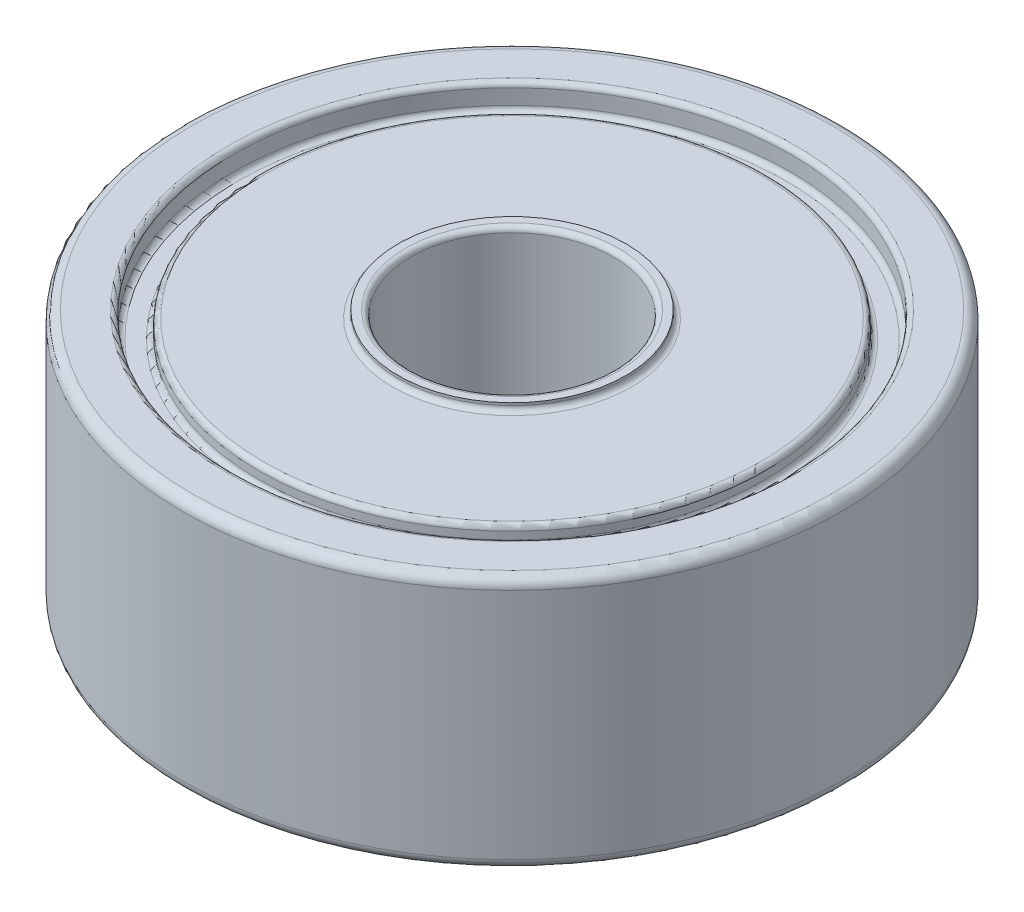
ISO-10303-21;
HEADER;
FILE_DESCRIPTION(('STEP AP214'),'2;1');
FILE_NAME('part.step','',(''),(''),'','','');
FILE_SCHEMA(('AUTOMOTIVE_DESIGN { 1 0 10303 214 1 1 1 1 }'));
ENDSEC;
DATA;
#1=APPLICATION_CONTEXT('core data for automotive mechanical design processes');
#2=APPLICATION_PROTOCOL_DEFINITION('international standard','automotive_design',2000,#1);
#3=PRODUCT_CONTEXT('',#1,'mechanical');
#4=PRODUCT('Part','Part','',(#3));
#5=PRODUCT_RELATED_PRODUCT_CATEGORY('part','',(#4));
#6=PRODUCT_DEFINITION_FORMATION('','',#4);
#7=PRODUCT_DEFINITION_CONTEXT('part definition',#1,'design');
#8=PRODUCT_DEFINITION('design','',#6,#7);
#9=PRODUCT_DEFINITION_SHAPE('','',#8);
#10=(LENGTH_UNIT() NAMED_UNIT(*) SI_UNIT(.MILLI.,.METRE.));
#11=(NAMED_UNIT(*) PLANE_ANGLE_UNIT() SI_UNIT($,.RADIAN.));
#12=(NAMED_UNIT(*) SI_UNIT($,.STERADIAN.) SOLID_ANGLE_UNIT());
#13=UNCERTAINTY_MEASURE_WITH_UNIT(LENGTH_MEASURE(1.E-05),#10,'distance_accuracy_value','');
#14=(GEOMETRIC_REPRESENTATION_CONTEXT(3) GLOBAL_UNCERTAINTY_ASSIGNED_CONTEXT((#13)) GLOBAL_UNIT_ASSIGNED_CONTEXT((#10,
#11,#12)) REPRESENTATION_CONTEXT('',''));
#15=CARTESIAN_POINT('',(0.,0.,0.));
#16=DIRECTION('',(0.,0.,1.));
#17=DIRECTION('',(1.,0.,0.));
#18=AXIS2_PLACEMENT_3D('',#15,#16,#17);
#19=CARTESIAN_POINT('',(0.,-2.5,0.));
#20=DIRECTION('',(0.,1.,0.));
#21=DIRECTION('',(0.,0.,1.));
#22=AXIS2_PLACEMENT_3D('',#19,#20,#21);
#23=PLANE('',#22);
#24=CARTESIAN_POINT('',(0.,-2.5,0.));
#25=DIRECTION('',(0.,1.,0.));
#26=DIRECTION('',(0.,0.,1.));
#27=AXIS2_PLACEMENT_3D('',#24,#25,#26);
#28=CIRCLE('',#27,6.3);
#29=CARTESIAN_POINT('',(0.,-2.5,6.3));
#30=VERTEX_POINT('',#29);
#31=EDGE_CURVE('E105',#30,#30,#28,.F.);
#32=ORIENTED_EDGE('',*,*,#31,.T.);
#33=EDGE_LOOP('',(#32));
#34=FACE_BOUND('',#33,.T.);
#35=CARTESIAN_POINT('',(0.,-2.5,0.));
#36=DIRECTION('',(0.,-1.,0.));
#37=DIRECTION('',(0.,0.,-1.));
#38=AXIS2_PLACEMENT_3D('',#35,#36,#37);
#39=CIRCLE('',#38,5.5);
#40=CARTESIAN_POINT('',(0.,-2.5,-5.5));
#41=VERTEX_POINT('',#40);
#42=EDGE_CURVE('E117',#41,#41,#39,.T.);
#43=ORIENTED_EDGE('',*,*,#42,.F.);
#44=EDGE_LOOP('',(#43));
#45=FACE_BOUND('',#44,.T.);
#46=ADVANCED_FACE('F34',(#34,#45),#23,.F.);
#47=CARTESIAN_POINT('',(0.,-2.5,0.));
#48=DIRECTION('',(0.,1.,0.));
#49=DIRECTION('',(0.,0.,1.));
#50=AXIS2_PLACEMENT_3D('',#47,#48,#49);
#51=CIRCLE('',#50,2.1);
#52=CARTESIAN_POINT('',(0.,-2.5,2.1));
#53=VERTEX_POINT('',#52);
#54=EDGE_CURVE('E49',#53,#53,#51,.T.);
#55=ORIENTED_EDGE('',*,*,#54,.T.);
#56=EDGE_LOOP('',(#55));
#57=FACE_BOUND('',#56,.T.);
#58=CARTESIAN_POINT('',(0.,-2.5,0.));
#59=DIRECTION('',(0.,-1.,0.));
#60=DIRECTION('',(0.,0.,-1.));
#61=AXIS2_PLACEMENT_3D('',#58,#59,#60);
#62=CIRCLE('',#61,2.25);
#63=CARTESIAN_POINT('',(0.,-2.5,-2.25));
#64=VERTEX_POINT('',#63);
#65=EDGE_CURVE('E123',#64,#64,#62,.T.);
#66=ORIENTED_EDGE('',*,*,#65,.T.);
#67=EDGE_LOOP('',(#66));
#68=FACE_BOUND('',#67,.T.);
#69=ADVANCED_FACE('F127',(#57,#68),#23,.F.);
#70=CARTESIAN_POINT('',(0.,2.5,0.));
#71=DIRECTION('',(0.,1.,0.));
#72=DIRECTION('',(0.,0.,1.));
#73=AXIS2_PLACEMENT_3D('',#70,#71,#72);
#74=PLANE('',#73);
#75=CARTESIAN_POINT('',(0.,2.5,0.));
#76=DIRECTION('',(0.,1.,0.));
#77=DIRECTION('',(0.,0.,1.));
#78=AXIS2_PLACEMENT_3D('',#75,#76,#77);
#79=CIRCLE('',#78,5.6);
#80=CARTESIAN_POINT('',(0.,2.5,5.6));
#81=VERTEX_POINT('',#80);
#82=EDGE_CURVE('E78',#81,#81,#79,.F.);
#83=ORIENTED_EDGE('',*,*,#82,.T.);
#84=EDGE_LOOP('',(#83));
#85=FACE_BOUND('',#84,.T.);
#86=CARTESIAN_POINT('',(0.,2.5,0.));
#87=DIRECTION('',(0.,1.,0.));
#88=DIRECTION('',(0.,0.,1.));
#89=AXIS2_PLACEMENT_3D('',#86,#87,#88);
#90=CIRCLE('',#89,6.3);
#91=CARTESIAN_POINT('',(0.,2.5,6.3));
#92=VERTEX_POINT('',#91);
#93=EDGE_CURVE('E102',#92,#92,#90,.T.);
#94=ORIENTED_EDGE('',*,*,#93,.T.);
#95=EDGE_LOOP('',(#94));
#96=FACE_BOUND('',#95,.T.);
#97=ADVANCED_FACE('F152',(#85,#96),#74,.T.);
#98=CARTESIAN_POINT('',(0.,2.5,0.));
#99=DIRECTION('',(0.,1.,0.));
#100=DIRECTION('',(0.,0.,1.));
#101=AXIS2_PLACEMENT_3D('',#98,#99,#100);
#102=CIRCLE('',#101,2.1);
#103=CARTESIAN_POINT('',(0.,2.5,2.1));
#104=VERTEX_POINT('',#103);
#105=EDGE_CURVE('E54',#104,#104,#102,.F.);
#106=ORIENTED_EDGE('',*,*,#105,.T.);
#107=EDGE_LOOP('',(#106));
#108=FACE_BOUND('',#107,.T.);
#109=CARTESIAN_POINT('',(0.,2.5,0.));
#110=DIRECTION('',(0.,-1.,0.));
#111=DIRECTION('',(0.,0.,-1.));
#112=AXIS2_PLACEMENT_3D('',#109,#110,#111);
#113=CIRCLE('',#112,2.25);
#114=CARTESIAN_POINT('',(0.,2.5,-2.25));
#115=VERTEX_POINT('',#114);
#116=EDGE_CURVE('E114',#115,#115,#113,.T.);
#117=ORIENTED_EDGE('',*,*,#116,.F.);
#118=EDGE_LOOP('',(#117));
#119=FACE_BOUND('',#118,.T.);
#120=ADVANCED_FACE('F162',(#108,#119),#74,.T.);
#121=CARTESIAN_POINT('',(0.,2.5,0.));
#122=DIRECTION('',(0.,-1.,0.));
#123=DIRECTION('',(0.,0.,-1.));
#124=AXIS2_PLACEMENT_3D('',#121,#122,#123);
#125=CYLINDRICAL_SURFACE('',#124,6.5);
#126=CARTESIAN_POINT('',(0.,-2.3,0.));
#127=DIRECTION('',(0.,1.,0.));
#128=DIRECTION('',(0.,0.,1.));
#129=AXIS2_PLACEMENT_3D('',#126,#127,#128);
#130=CIRCLE('',#129,6.5);
#131=CARTESIAN_POINT('',(0.,-2.3,6.5));
#132=VERTEX_POINT('',#131);
#133=EDGE_CURVE('E108',#132,#132,#130,.T.);
#134=ORIENTED_EDGE('',*,*,#133,.T.);
#135=EDGE_LOOP('',(#134));
#136=FACE_BOUND('',#135,.T.);
#137=CARTESIAN_POINT('',(0.,2.3,0.));
#138=DIRECTION('',(0.,1.,0.));
#139=DIRECTION('',(0.,0.,1.));
#140=AXIS2_PLACEMENT_3D('',#137,#138,#139);
#141=CIRCLE('',#140,6.5);
#142=CARTESIAN_POINT('',(0.,2.3,6.5));
#143=VERTEX_POINT('',#142);
#144=EDGE_CURVE('E111',#143,#143,#141,.F.);
#145=ORIENTED_EDGE('',*,*,#144,.T.);
#146=EDGE_LOOP('',(#145));
#147=FACE_BOUND('',#146,.T.);
#148=ADVANCED_FACE('F158',(#136,#147),#125,.T.);
#149=CARTESIAN_POINT('',(0.,-2.5,0.));
#150=DIRECTION('',(0.,1.,0.));
#151=DIRECTION('',(0.,0.,1.));
#152=AXIS2_PLACEMENT_3D('',#149,#150,#151);
#153=CYLINDRICAL_SURFACE('',#152,2.);
#154=CARTESIAN_POINT('',(0.,2.4,0.));
#155=DIRECTION('',(0.,1.,0.));
#156=DIRECTION('',(0.,0.,1.));
#157=AXIS2_PLACEMENT_3D('',#154,#155,#156);
#158=CIRCLE('',#157,2.);
#159=CARTESIAN_POINT('',(0.,2.4,2.));
#160=VERTEX_POINT('',#159);
#161=EDGE_CURVE('E57',#160,#160,#158,.T.);
#162=ORIENTED_EDGE('',*,*,#161,.T.);
#163=EDGE_LOOP('',(#162));
#164=FACE_BOUND('',#163,.T.);
#165=CARTESIAN_POINT('',(0.,-2.4,0.));
#166=DIRECTION('',(0.,1.,0.));
#167=DIRECTION('',(0.,0.,1.));
#168=AXIS2_PLACEMENT_3D('',#165,#166,#167);
#169=CIRCLE('',#168,2.);
#170=CARTESIAN_POINT('',(0.,-2.4,2.));
#171=VERTEX_POINT('',#170);
#172=EDGE_CURVE('E60',#171,#171,#169,.F.);
#173=ORIENTED_EDGE('',*,*,#172,.T.);
#174=EDGE_LOOP('',(#173));
#175=FACE_BOUND('',#174,.T.);
#176=ADVANCED_FACE('F161',(#164,#175),#153,.F.);
#177=CARTESIAN_POINT('',(0.,-2.3,0.));
#178=DIRECTION('',(0.,1.,0.));
#179=DIRECTION('',(0.,0.,1.));
#180=AXIS2_PLACEMENT_3D('',#177,#178,#179);
#181=TOROIDAL_SURFACE('',#180,6.3,0.2);
#182=ORIENTED_EDGE('',*,*,#31,.F.);
#183=EDGE_LOOP('',(#182));
#184=FACE_BOUND('',#183,.T.);
#185=ORIENTED_EDGE('',*,*,#133,.F.);
#186=EDGE_LOOP('',(#185));
#187=FACE_BOUND('',#186,.T.);
#188=ADVANCED_FACE('F164',(#184,#187),#181,.T.);
#189=CARTESIAN_POINT('',(0.,2.3,0.));
#190=DIRECTION('',(0.,1.,0.));
#191=DIRECTION('',(0.,0.,1.));
#192=AXIS2_PLACEMENT_3D('',#189,#190,#191);
#193=TOROIDAL_SURFACE('',#192,6.3,0.2);
#194=ORIENTED_EDGE('',*,*,#144,.F.);
#195=EDGE_LOOP('',(#194));
#196=FACE_BOUND('',#195,.T.);
#197=ORIENTED_EDGE('',*,*,#93,.F.);
#198=EDGE_LOOP('',(#197));
#199=FACE_BOUND('',#198,.T.);
#200=ADVANCED_FACE('F167',(#196,#199),#193,.T.);
#201=CARTESIAN_POINT('',(0.,0.,0.));
#202=DIRECTION('',(0.,-1.,0.));
#203=DIRECTION('',(0.,0.,-1.));
#204=AXIS2_PLACEMENT_3D('',#201,#202,#203);
#205=CYLINDRICAL_SURFACE('',#204,5.5);
#206=CARTESIAN_POINT('',(0.,2.4,0.));
#207=DIRECTION('',(0.,1.,0.));
#208=DIRECTION('',(0.,0.,1.));
#209=AXIS2_PLACEMENT_3D('',#206,#207,#208);
#210=CIRCLE('',#209,5.5);
#211=CARTESIAN_POINT('',(0.,2.4,5.5));
#212=VERTEX_POINT('',#211);
#213=EDGE_CURVE('E72',#212,#212,#210,.T.);
#214=ORIENTED_EDGE('',*,*,#213,.T.);
#215=EDGE_LOOP('',(#214));
#216=FACE_BOUND('',#215,.T.);
#217=CARTESIAN_POINT('',(0.,2.1,0.));
#218=DIRECTION('',(0.,1.,0.));
#219=DIRECTION('',(0.,0.,1.));
#220=AXIS2_PLACEMENT_3D('',#217,#218,#219);
#221=CIRCLE('',#220,5.5);
#222=CARTESIAN_POINT('',(0.,2.1,5.5));
#223=VERTEX_POINT('',#222);
#224=EDGE_CURVE('E75',#223,#223,#221,.F.);
#225=ORIENTED_EDGE('',*,*,#224,.T.);
#226=EDGE_LOOP('',(#225));
#227=FACE_BOUND('',#226,.T.);
#228=ADVANCED_FACE('F171',(#216,#227),#205,.F.);
#229=CARTESIAN_POINT('',(-5.5,2.,0.));
#230=DIRECTION('',(0.,1.,0.));
#231=DIRECTION('',(0.,0.,1.));
#232=AXIS2_PLACEMENT_3D('',#229,#230,#231);
#233=PLANE('',#232);
#234=CARTESIAN_POINT('',(0.,2.,0.));
#235=DIRECTION('',(0.,1.,0.));
#236=DIRECTION('',(0.,0.,1.));
#237=AXIS2_PLACEMENT_3D('',#234,#235,#236);
#238=CIRCLE('',#237,5.1);
#239=CARTESIAN_POINT('',(0.,2.,5.1));
#240=VERTEX_POINT('',#239);
#241=EDGE_CURVE('E87',#240,#240,#238,.F.);
#242=ORIENTED_EDGE('',*,*,#241,.T.);
#243=EDGE_LOOP('',(#242));
#244=FACE_BOUND('',#243,.T.);
#245=CARTESIAN_POINT('',(0.,2.,0.));
#246=DIRECTION('',(0.,1.,0.));
#247=DIRECTION('',(0.,0.,1.));
#248=AXIS2_PLACEMENT_3D('',#245,#246,#247);
#249=CIRCLE('',#248,5.4);
#250=CARTESIAN_POINT('',(0.,2.,5.4));
#251=VERTEX_POINT('',#250);
#252=EDGE_CURVE('E90',#251,#251,#249,.T.);
#253=ORIENTED_EDGE('',*,*,#252,.T.);
#254=EDGE_LOOP('',(#253));
#255=FACE_BOUND('',#254,.T.);
#256=ADVANCED_FACE('F238',(#244,#255),#233,.T.);
#257=CARTESIAN_POINT('',(0.,0.,0.));
#258=DIRECTION('',(0.,-1.,0.));
#259=DIRECTION('',(0.,0.,-1.));
#260=AXIS2_PLACEMENT_3D('',#257,#258,#259);
#261=CYLINDRICAL_SURFACE('',#260,5.);
#262=CARTESIAN_POINT('',(0.,2.1,0.));
#263=DIRECTION('',(0.,1.,0.));
#264=DIRECTION('',(0.,0.,1.));
#265=AXIS2_PLACEMENT_3D('',#262,#263,#264);
#266=CIRCLE('',#265,5.);
#267=CARTESIAN_POINT('',(0.,2.1,5.));
#268=VERTEX_POINT('',#267);
#269=EDGE_CURVE('E81',#268,#268,#266,.T.);
#270=ORIENTED_EDGE('',*,*,#269,.T.);
#271=EDGE_LOOP('',(#270));
#272=FACE_BOUND('',#271,.T.);
#273=CARTESIAN_POINT('',(0.,2.25,0.));
#274=DIRECTION('',(0.,1.,0.));
#275=DIRECTION('',(0.,0.,1.));
#276=AXIS2_PLACEMENT_3D('',#273,#274,#275);
#277=CIRCLE('',#276,5.);
#278=CARTESIAN_POINT('',(0.,2.25,5.));
#279=VERTEX_POINT('',#278);
#280=EDGE_CURVE('E84',#279,#279,#277,.F.);
#281=ORIENTED_EDGE('',*,*,#280,.T.);
#282=EDGE_LOOP('',(#281));
#283=FACE_BOUND('',#282,.T.);
#284=ADVANCED_FACE('F234',(#272,#283),#261,.T.);
#285=CARTESIAN_POINT('',(-5.,2.35,0.));
#286=DIRECTION('',(0.,1.,0.));
#287=DIRECTION('',(0.,0.,1.));
#288=AXIS2_PLACEMENT_3D('',#285,#286,#287);
#289=PLANE('',#288);
#290=CARTESIAN_POINT('',(0.,2.35,0.));
#291=DIRECTION('',(0.,1.,0.));
#292=DIRECTION('',(0.,0.,1.));
#293=AXIS2_PLACEMENT_3D('',#290,#291,#292);
#294=CIRCLE('',#293,4.9);
#295=CARTESIAN_POINT('',(0.,2.35,4.9));
#296=VERTEX_POINT('',#295);
#297=EDGE_CURVE('E66',#296,#296,#294,.T.);
#298=ORIENTED_EDGE('',*,*,#297,.T.);
#299=EDGE_LOOP('',(#298));
#300=FACE_BOUND('',#299,.T.);
#301=CARTESIAN_POINT('',(0.,2.35,0.));
#302=DIRECTION('',(0.,1.,0.));
#303=DIRECTION('',(0.,0.,1.));
#304=AXIS2_PLACEMENT_3D('',#301,#302,#303);
#305=CIRCLE('',#304,2.35);
#306=CARTESIAN_POINT('',(0.,2.35,2.35));
#307=VERTEX_POINT('',#306);
#308=EDGE_CURVE('E69',#307,#307,#305,.F.);
#309=ORIENTED_EDGE('',*,*,#308,.T.);
#310=EDGE_LOOP('',(#309));
#311=FACE_BOUND('',#310,.T.);
#312=ADVANCED_FACE('F230',(#300,#311),#289,.T.);
#313=CARTESIAN_POINT('',(0.,0.,0.));
#314=DIRECTION('',(0.,-1.,0.));
#315=DIRECTION('',(0.,0.,-1.));
#316=AXIS2_PLACEMENT_3D('',#313,#314,#315);
#317=CYLINDRICAL_SURFACE('',#316,2.25);
#318=CARTESIAN_POINT('',(0.,2.45,0.));
#319=DIRECTION('',(0.,1.,0.));
#320=DIRECTION('',(0.,0.,1.));
#321=AXIS2_PLACEMENT_3D('',#318,#319,#320);
#322=CIRCLE('',#321,2.25);
#323=CARTESIAN_POINT('',(0.,2.45,2.25));
#324=VERTEX_POINT('',#323);
#325=EDGE_CURVE('E63',#324,#324,#322,.T.);
#326=ORIENTED_EDGE('',*,*,#325,.T.);
#327=EDGE_LOOP('',(#326));
#328=FACE_BOUND('',#327,.T.);
#329=ORIENTED_EDGE('',*,*,#116,.T.);
#330=EDGE_LOOP('',(#329));
#331=FACE_BOUND('',#330,.T.);
#332=ADVANCED_FACE('F224',(#328,#331),#317,.T.);
#333=CARTESIAN_POINT('',(0.,0.,0.));
#334=DIRECTION('',(0.,1.,0.));
#335=DIRECTION('',(0.,0.,-1.));
#336=AXIS2_PLACEMENT_3D('',#333,#334,#335);
#337=CYLINDRICAL_SURFACE('',#336,5.5);
#338=CARTESIAN_POINT('',(0.,-2.1,0.));
#339=DIRECTION('',(0.,-1.,0.));
#340=DIRECTION('',(0.,0.,-1.));
#341=AXIS2_PLACEMENT_3D('',#338,#339,#340);
#342=CIRCLE('',#341,5.5);
#343=CARTESIAN_POINT('',(0.,-2.1,-5.5));
#344=VERTEX_POINT('',#343);
#345=EDGE_CURVE('E93',#344,#344,#342,.F.);
#346=ORIENTED_EDGE('',*,*,#345,.T.);
#347=EDGE_LOOP('',(#346));
#348=FACE_BOUND('',#347,.T.);
#349=ORIENTED_EDGE('',*,*,#42,.T.);
#350=EDGE_LOOP('',(#349));
#351=FACE_BOUND('',#350,.T.);
#352=ADVANCED_FACE('F218',(#348,#351),#337,.F.);
#353=CARTESIAN_POINT('',(-5.5,-2.,0.));
#354=DIRECTION('',(0.,-1.,0.));
#355=DIRECTION('',(0.,0.,1.));
#356=AXIS2_PLACEMENT_3D('',#353,#354,#355);
#357=PLANE('',#356);
#358=CARTESIAN_POINT('',(0.,-2.,0.));
#359=DIRECTION('',(0.,-1.,0.));
#360=DIRECTION('',(0.,0.,-1.));
#361=AXIS2_PLACEMENT_3D('',#358,#359,#360);
#362=CIRCLE('',#361,5.4);
#363=CARTESIAN_POINT('',(0.,-2.,-5.4));
#364=VERTEX_POINT('',#363);
#365=EDGE_CURVE('E96',#364,#364,#362,.T.);
#366=ORIENTED_EDGE('',*,*,#365,.T.);
#367=EDGE_LOOP('',(#366));
#368=FACE_BOUND('',#367,.T.);
#369=CARTESIAN_POINT('',(0.,-2.,0.));
#370=DIRECTION('',(0.,-1.,0.));
#371=DIRECTION('',(0.,0.,-1.));
#372=AXIS2_PLACEMENT_3D('',#369,#370,#371);
#373=CIRCLE('',#372,5.1);
#374=CARTESIAN_POINT('',(0.,-2.,-5.1));
#375=VERTEX_POINT('',#374);
#376=EDGE_CURVE('E99',#375,#375,#373,.F.);
#377=ORIENTED_EDGE('',*,*,#376,.T.);
#378=EDGE_LOOP('',(#377));
#379=FACE_BOUND('',#378,.T.);
#380=ADVANCED_FACE('F144',(#368,#379),#357,.T.);
#381=CARTESIAN_POINT('',(0.,0.,0.));
#382=DIRECTION('',(0.,1.,0.));
#383=DIRECTION('',(0.,0.,-1.));
#384=AXIS2_PLACEMENT_3D('',#381,#382,#383);
#385=CYLINDRICAL_SURFACE('',#384,5.);
#386=CARTESIAN_POINT('',(0.,-2.25,0.));
#387=DIRECTION('',(0.,-1.,0.));
#388=DIRECTION('',(0.,0.,-1.));
#389=AXIS2_PLACEMENT_3D('',#386,#387,#388);
#390=CIRCLE('',#389,5.);
#391=CARTESIAN_POINT('',(0.,-2.25,-5.));
#392=VERTEX_POINT('',#391);
#393=EDGE_CURVE('E10',#392,#392,#390,.F.);
#394=ORIENTED_EDGE('',*,*,#393,.T.);
#395=EDGE_LOOP('',(#394));
#396=FACE_BOUND('',#395,.T.);
#397=CARTESIAN_POINT('',(0.,-2.1,0.));
#398=DIRECTION('',(0.,-1.,0.));
#399=DIRECTION('',(0.,0.,-1.));
#400=AXIS2_PLACEMENT_3D('',#397,#398,#399);
#401=CIRCLE('',#400,5.);
#402=CARTESIAN_POINT('',(0.,-2.1,-5.));
#403=VERTEX_POINT('',#402);
#404=EDGE_CURVE('E41',#403,#403,#401,.T.);
#405=ORIENTED_EDGE('',*,*,#404,.T.);
#406=EDGE_LOOP('',(#405));
#407=FACE_BOUND('',#406,.T.);
#408=ADVANCED_FACE('F138',(#396,#407),#385,.T.);
#409=CARTESIAN_POINT('',(-5.,-2.35,0.));
#410=DIRECTION('',(0.,-1.,0.));
#411=DIRECTION('',(0.,0.,1.));
#412=AXIS2_PLACEMENT_3D('',#409,#410,#411);
#413=PLANE('',#412);
#414=CARTESIAN_POINT('',(0.,-2.35,0.));
#415=DIRECTION('',(0.,-1.,0.));
#416=DIRECTION('',(0.,0.,-1.));
#417=AXIS2_PLACEMENT_3D('',#414,#415,#416);
#418=CIRCLE('',#417,4.9);
#419=CARTESIAN_POINT('',(0.,-2.35,-4.9));
#420=VERTEX_POINT('',#419);
#421=EDGE_CURVE('E45',#420,#420,#418,.T.);
#422=ORIENTED_EDGE('',*,*,#421,.T.);
#423=EDGE_LOOP('',(#422));
#424=FACE_BOUND('',#423,.T.);
#425=CARTESIAN_POINT('',(0.,-2.35,0.));
#426=DIRECTION('',(0.,-1.,0.));
#427=DIRECTION('',(0.,0.,-1.));
#428=AXIS2_PLACEMENT_3D('',#425,#426,#427);
#429=CIRCLE('',#428,2.25);
#430=CARTESIAN_POINT('',(0.,-2.35,-2.25));
#431=VERTEX_POINT('',#430);
#432=EDGE_CURVE('E120',#431,#431,#429,.T.);
#433=ORIENTED_EDGE('',*,*,#432,.F.);
#434=EDGE_LOOP('',(#433));
#435=FACE_BOUND('',#434,.T.);
#436=ADVANCED_FACE('F133',(#424,#435),#413,.T.);
#437=CARTESIAN_POINT('',(0.,0.,0.));
#438=DIRECTION('',(0.,1.,0.));
#439=DIRECTION('',(0.,0.,-1.));
#440=AXIS2_PLACEMENT_3D('',#437,#438,#439);
#441=CYLINDRICAL_SURFACE('',#440,2.25);
#442=ORIENTED_EDGE('',*,*,#65,.F.);
#443=EDGE_LOOP('',(#442));
#444=FACE_BOUND('',#443,.T.);
#445=ORIENTED_EDGE('',*,*,#432,.T.);
#446=EDGE_LOOP('',(#445));
#447=FACE_BOUND('',#446,.T.);
#448=ADVANCED_FACE('F129',(#444,#447),#441,.T.);
#449=CARTESIAN_POINT('',(0.,-2.1,0.));
#450=DIRECTION('',(0.,-1.,0.));
#451=DIRECTION('',(0.,0.,-1.));
#452=AXIS2_PLACEMENT_3D('',#449,#450,#451);
#453=TOROIDAL_SURFACE('',#452,5.4,0.1);
#454=ORIENTED_EDGE('',*,*,#345,.F.);
#455=EDGE_LOOP('',(#454));
#456=FACE_BOUND('',#455,.T.);
#457=ORIENTED_EDGE('',*,*,#365,.F.);
#458=EDGE_LOOP('',(#457));
#459=FACE_BOUND('',#458,.T.);
#460=ADVANCED_FACE('F132',(#456,#459),#453,.F.);
#461=CARTESIAN_POINT('',(0.,2.1,0.));
#462=DIRECTION('',(0.,1.,0.));
#463=DIRECTION('',(0.,0.,1.));
#464=AXIS2_PLACEMENT_3D('',#461,#462,#463);
#465=TOROIDAL_SURFACE('',#464,5.1,0.1);
#466=ORIENTED_EDGE('',*,*,#269,.F.);
#467=EDGE_LOOP('',(#466));
#468=FACE_BOUND('',#467,.T.);
#469=ORIENTED_EDGE('',*,*,#241,.F.);
#470=EDGE_LOOP('',(#469));
#471=FACE_BOUND('',#470,.T.);
#472=ADVANCED_FACE('F175',(#468,#471),#465,.F.);
#473=CARTESIAN_POINT('',(0.,2.4,0.));
#474=DIRECTION('',(0.,1.,0.));
#475=DIRECTION('',(0.,0.,1.));
#476=AXIS2_PLACEMENT_3D('',#473,#474,#475);
#477=TOROIDAL_SURFACE('',#476,5.6,0.1);
#478=ORIENTED_EDGE('',*,*,#213,.F.);
#479=EDGE_LOOP('',(#478));
#480=FACE_BOUND('',#479,.T.);
#481=ORIENTED_EDGE('',*,*,#82,.F.);
#482=EDGE_LOOP('',(#481));
#483=FACE_BOUND('',#482,.T.);
#484=ADVANCED_FACE('F179',(#480,#483),#477,.T.);
#485=CARTESIAN_POINT('',(0.,2.1,0.));
#486=DIRECTION('',(0.,1.,0.));
#487=DIRECTION('',(0.,0.,1.));
#488=AXIS2_PLACEMENT_3D('',#485,#486,#487);
#489=TOROIDAL_SURFACE('',#488,5.4,0.1);
#490=ORIENTED_EDGE('',*,*,#252,.F.);
#491=EDGE_LOOP('',(#490));
#492=FACE_BOUND('',#491,.T.);
#493=ORIENTED_EDGE('',*,*,#224,.F.);
#494=EDGE_LOOP('',(#493));
#495=FACE_BOUND('',#494,.T.);
#496=ADVANCED_FACE('F183',(#492,#495),#489,.F.);
#497=CARTESIAN_POINT('',(0.,2.25,0.));
#498=DIRECTION('',(0.,1.,0.));
#499=DIRECTION('',(0.,0.,1.));
#500=AXIS2_PLACEMENT_3D('',#497,#498,#499);
#501=TOROIDAL_SURFACE('',#500,4.9,0.1);
#502=ORIENTED_EDGE('',*,*,#297,.F.);
#503=EDGE_LOOP('',(#502));
#504=FACE_BOUND('',#503,.T.);
#505=ORIENTED_EDGE('',*,*,#280,.F.);
#506=EDGE_LOOP('',(#505));
#507=FACE_BOUND('',#506,.T.);
#508=ADVANCED_FACE('F187',(#504,#507),#501,.T.);
#509=CARTESIAN_POINT('',(0.,2.45,0.));
#510=DIRECTION('',(0.,1.,0.));
#511=DIRECTION('',(0.,0.,1.));
#512=AXIS2_PLACEMENT_3D('',#509,#510,#511);
#513=TOROIDAL_SURFACE('',#512,2.35,0.1);
#514=ORIENTED_EDGE('',*,*,#325,.F.);
#515=EDGE_LOOP('',(#514));
#516=FACE_BOUND('',#515,.T.);
#517=ORIENTED_EDGE('',*,*,#308,.F.);
#518=EDGE_LOOP('',(#517));
#519=FACE_BOUND('',#518,.T.);
#520=ADVANCED_FACE('F191',(#516,#519),#513,.F.);
#521=CARTESIAN_POINT('',(0.,2.4,0.));
#522=DIRECTION('',(0.,1.,0.));
#523=DIRECTION('',(0.,0.,1.));
#524=AXIS2_PLACEMENT_3D('',#521,#522,#523);
#525=TOROIDAL_SURFACE('',#524,2.1,0.1);
#526=ORIENTED_EDGE('',*,*,#105,.F.);
#527=EDGE_LOOP('',(#526));
#528=FACE_BOUND('',#527,.T.);
#529=ORIENTED_EDGE('',*,*,#161,.F.);
#530=EDGE_LOOP('',(#529));
#531=FACE_BOUND('',#530,.T.);
#532=ADVANCED_FACE('F195',(#528,#531),#525,.T.);
#533=CARTESIAN_POINT('',(0.,-2.4,0.));
#534=DIRECTION('',(0.,1.,0.));
#535=DIRECTION('',(0.,0.,1.));
#536=AXIS2_PLACEMENT_3D('',#533,#534,#535);
#537=TOROIDAL_SURFACE('',#536,2.1,0.1);
#538=ORIENTED_EDGE('',*,*,#172,.F.);
#539=EDGE_LOOP('',(#538));
#540=FACE_BOUND('',#539,.T.);
#541=ORIENTED_EDGE('',*,*,#54,.F.);
#542=EDGE_LOOP('',(#541));
#543=FACE_BOUND('',#542,.T.);
#544=ADVANCED_FACE('F199',(#540,#543),#537,.T.);
#545=CARTESIAN_POINT('',(0.,-2.25,0.));
#546=DIRECTION('',(0.,-1.,0.));
#547=DIRECTION('',(0.,0.,-1.));
#548=AXIS2_PLACEMENT_3D('',#545,#546,#547);
#549=TOROIDAL_SURFACE('',#548,4.9,0.1);
#550=ORIENTED_EDGE('',*,*,#393,.F.);
#551=EDGE_LOOP('',(#550));
#552=FACE_BOUND('',#551,.T.);
#553=ORIENTED_EDGE('',*,*,#421,.F.);
#554=EDGE_LOOP('',(#553));
#555=FACE_BOUND('',#554,.T.);
#556=ADVANCED_FACE('F202',(#552,#555),#549,.T.);
#557=CARTESIAN_POINT('',(0.,-2.1,0.));
#558=DIRECTION('',(0.,-1.,0.));
#559=DIRECTION('',(0.,0.,-1.));
#560=AXIS2_PLACEMENT_3D('',#557,#558,#559);
#561=TOROIDAL_SURFACE('',#560,5.1,0.1);
#562=ORIENTED_EDGE('',*,*,#376,.F.);
#563=EDGE_LOOP('',(#562));
#564=FACE_BOUND('',#563,.T.);
#565=ORIENTED_EDGE('',*,*,#404,.F.);
#566=EDGE_LOOP('',(#565));
#567=FACE_BOUND('',#566,.T.);
#568=ADVANCED_FACE('F36',(#564,#567),#561,.F.);
#569=CLOSED_SHELL('',(#46,#69,#97,#120,#148,#176,#188,#200,#228,#256,#284,#312,#332,#352,#380,
#408,#436,#448,#460,#472,#484,#496,#508,#520,#532,#544,#556,#568));
#570=MANIFOLD_SOLID_BREP('B2',#569);
#571=ADVANCED_BREP_SHAPE_REPRESENTATION('',(#18,#570),#14);
#572=SHAPE_DEFINITION_REPRESENTATION(#9,#571);
ENDSEC;
END-ISO-10303-21;
